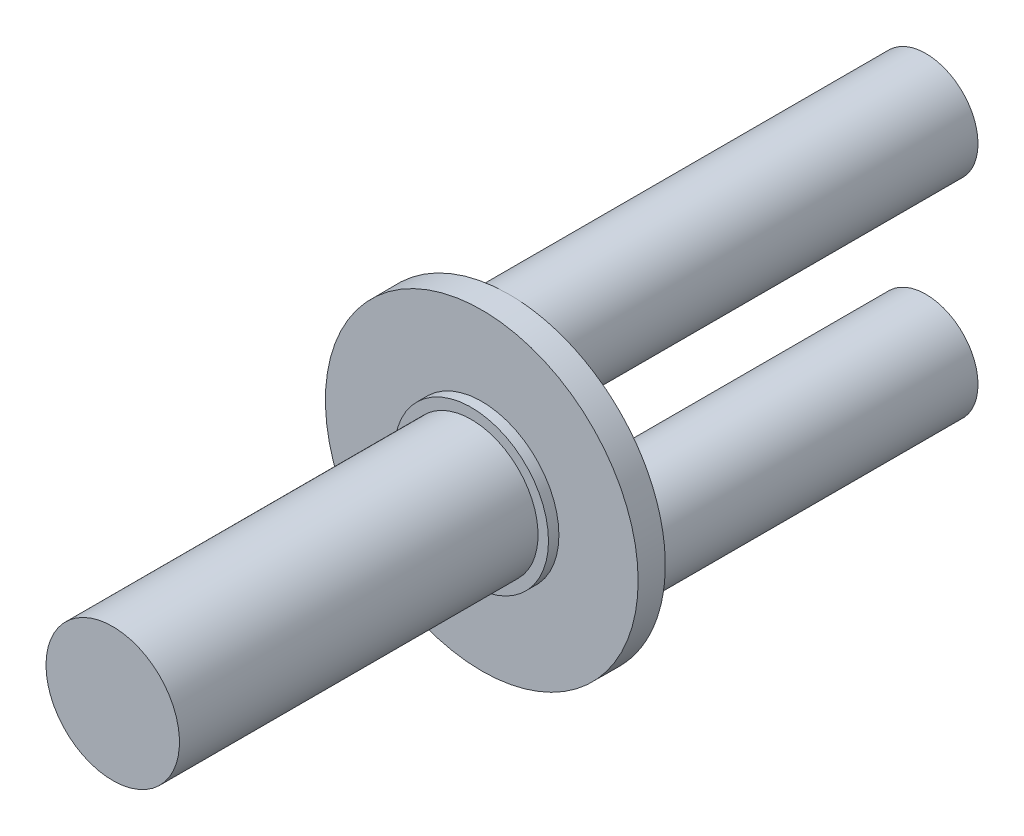
ISO-10303-21;
HEADER;
FILE_DESCRIPTION(('STEP AP214'),'2;1');
FILE_NAME('part.step','',(''),(''),'','','');
FILE_SCHEMA(('AUTOMOTIVE_DESIGN { 1 0 10303 214 1 1 1 1 }'));
ENDSEC;
DATA;
#1=APPLICATION_CONTEXT('core data for automotive mechanical design processes');
#2=APPLICATION_PROTOCOL_DEFINITION('international standard','automotive_design',2000,#1);
#3=PRODUCT_CONTEXT('',#1,'mechanical');
#4=PRODUCT('Part','Part','',(#3));
#5=PRODUCT_RELATED_PRODUCT_CATEGORY('part','',(#4));
#6=PRODUCT_DEFINITION_FORMATION('','',#4);
#7=PRODUCT_DEFINITION_CONTEXT('part definition',#1,'design');
#8=PRODUCT_DEFINITION('design','',#6,#7);
#9=PRODUCT_DEFINITION_SHAPE('','',#8);
#10=(LENGTH_UNIT() NAMED_UNIT(*) SI_UNIT(.MILLI.,.METRE.));
#11=(NAMED_UNIT(*) PLANE_ANGLE_UNIT() SI_UNIT($,.RADIAN.));
#12=(NAMED_UNIT(*) SI_UNIT($,.STERADIAN.) SOLID_ANGLE_UNIT());
#13=UNCERTAINTY_MEASURE_WITH_UNIT(LENGTH_MEASURE(1.E-05),#10,'distance_accuracy_value','');
#14=(GEOMETRIC_REPRESENTATION_CONTEXT(3) GLOBAL_UNCERTAINTY_ASSIGNED_CONTEXT((#13)) GLOBAL_UNIT_ASSIGNED_CONTEXT((#10,
#11,#12)) REPRESENTATION_CONTEXT('',''));
#15=CARTESIAN_POINT('',(0.,0.,0.));
#16=DIRECTION('',(0.,0.,1.));
#17=DIRECTION('',(1.,0.,0.));
#18=AXIS2_PLACEMENT_3D('',#15,#16,#17);
#19=CARTESIAN_POINT('',(0.,12.7,-12.7));
#20=DIRECTION('',(0.,0.,1.));
#21=DIRECTION('',(1.,0.,0.));
#22=AXIS2_PLACEMENT_3D('',#19,#20,#21);
#23=CYLINDRICAL_SURFACE('',#22,1.5875);
#24=CARTESIAN_POINT('',(0.,12.7,-12.7));
#25=DIRECTION('',(0.,0.,1.));
#26=DIRECTION('',(1.,0.,0.));
#27=AXIS2_PLACEMENT_3D('',#24,#25,#26);
#28=CIRCLE('',#27,1.5875);
#29=CARTESIAN_POINT('',(1.5875,12.7,-12.7));
#30=VERTEX_POINT('',#29);
#31=EDGE_CURVE('E11',#30,#30,#28,.T.);
#32=ORIENTED_EDGE('',*,*,#31,.T.);
#33=EDGE_LOOP('',(#32));
#34=FACE_BOUND('',#33,.T.);
#35=CARTESIAN_POINT('',(0.,12.7,0.));
#36=DIRECTION('',(0.,0.,1.));
#37=DIRECTION('',(1.,0.,0.));
#38=AXIS2_PLACEMENT_3D('',#35,#36,#37);
#39=CIRCLE('',#38,1.5875);
#40=CARTESIAN_POINT('',(0.,11.1125,0.));
#41=VERTEX_POINT('',#40);
#42=EDGE_CURVE('E44',#41,#41,#39,.T.);
#43=ORIENTED_EDGE('',*,*,#42,.F.);
#44=EDGE_LOOP('',(#43));
#45=FACE_BOUND('',#44,.T.);
#46=ADVANCED_FACE('F36',(#34,#45),#23,.T.);
#47=CARTESIAN_POINT('',(0.,12.7,-12.7));
#48=DIRECTION('',(0.,0.,1.));
#49=DIRECTION('',(1.,0.,0.));
#50=AXIS2_PLACEMENT_3D('',#47,#48,#49);
#51=PLANE('',#50);
#52=ORIENTED_EDGE('',*,*,#31,.F.);
#53=EDGE_LOOP('',(#52));
#54=FACE_BOUND('',#53,.T.);
#55=ADVANCED_FACE('F88',(#54),#51,.F.);
#56=CARTESIAN_POINT('',(0.,15.875,0.));
#57=DIRECTION('',(0.,0.,1.));
#58=DIRECTION('',(1.,0.,0.));
#59=AXIS2_PLACEMENT_3D('',#56,#57,#58);
#60=PLANE('',#59);
#61=ORIENTED_EDGE('',*,*,#42,.T.);
#62=CARTESIAN_POINT('',(0.,15.875,0.));
#63=DIRECTION('',(0.,0.,1.));
#64=DIRECTION('',(1.,0.,0.));
#65=AXIS2_PLACEMENT_3D('',#62,#63,#64);
#66=CIRCLE('',#65,4.76249999999999);
#67=CARTESIAN_POINT('',(0.,20.6375,0.));
#68=VERTEX_POINT('',#67);
#69=EDGE_CURVE('E59',#68,#41,#66,.T.);
#70=ORIENTED_EDGE('',*,*,#69,.F.);
#71=CARTESIAN_POINT('',(0.,19.05,0.));
#72=DIRECTION('',(0.,0.,1.));
#73=DIRECTION('',(1.,0.,0.));
#74=AXIS2_PLACEMENT_3D('',#71,#72,#73);
#75=CIRCLE('',#74,1.5875);
#76=EDGE_CURVE('E54',#68,#68,#75,.T.);
#77=ORIENTED_EDGE('',*,*,#76,.T.);
#78=EDGE_CURVE('E57',#41,#68,#66,.T.);
#79=ORIENTED_EDGE('',*,*,#78,.F.);
#80=EDGE_LOOP('',(#61,#70,#77,#79));
#81=FACE_BOUND('',#80,.T.);
#82=ADVANCED_FACE('F55',(#81),#60,.F.);
#83=CARTESIAN_POINT('',(0.,19.05,-12.7));
#84=DIRECTION('',(0.,0.,1.));
#85=DIRECTION('',(1.,0.,0.));
#86=AXIS2_PLACEMENT_3D('',#83,#84,#85);
#87=CYLINDRICAL_SURFACE('',#86,1.5875);
#88=CARTESIAN_POINT('',(0.,19.05,-12.7));
#89=DIRECTION('',(0.,0.,1.));
#90=DIRECTION('',(1.,0.,0.));
#91=AXIS2_PLACEMENT_3D('',#88,#89,#90);
#92=CIRCLE('',#91,1.5875);
#93=CARTESIAN_POINT('',(1.5875,19.05,-12.7));
#94=VERTEX_POINT('',#93);
#95=EDGE_CURVE('E61',#94,#94,#92,.T.);
#96=ORIENTED_EDGE('',*,*,#95,.T.);
#97=EDGE_LOOP('',(#96));
#98=FACE_BOUND('',#97,.T.);
#99=ORIENTED_EDGE('',*,*,#76,.F.);
#100=EDGE_LOOP('',(#99));
#101=FACE_BOUND('',#100,.T.);
#102=ADVANCED_FACE('F99',(#98,#101),#87,.T.);
#103=CARTESIAN_POINT('',(0.,19.05,-12.7));
#104=DIRECTION('',(0.,0.,1.));
#105=DIRECTION('',(1.,0.,0.));
#106=AXIS2_PLACEMENT_3D('',#103,#104,#105);
#107=PLANE('',#106);
#108=ORIENTED_EDGE('',*,*,#95,.F.);
#109=EDGE_LOOP('',(#108));
#110=FACE_BOUND('',#109,.T.);
#111=ADVANCED_FACE('F103',(#110),#107,.F.);
#112=CARTESIAN_POINT('',(0.,15.875,0.8255));
#113=DIRECTION('',(0.,0.,-1.));
#114=DIRECTION('',(-1.,0.,0.));
#115=AXIS2_PLACEMENT_3D('',#112,#113,#114);
#116=CYLINDRICAL_SURFACE('',#115,4.76249999999999);
#117=CARTESIAN_POINT('',(0.,15.875,0.8255));
#118=DIRECTION('',(0.,0.,1.));
#119=DIRECTION('',(1.,0.,0.));
#120=AXIS2_PLACEMENT_3D('',#117,#118,#119);
#121=CIRCLE('',#120,4.76249999999999);
#122=CARTESIAN_POINT('',(4.76249999999999,15.875,0.8255));
#123=VERTEX_POINT('',#122);
#124=EDGE_CURVE('E62',#123,#123,#121,.T.);
#125=ORIENTED_EDGE('',*,*,#124,.F.);
#126=EDGE_LOOP('',(#125));
#127=FACE_BOUND('',#126,.T.);
#128=ORIENTED_EDGE('',*,*,#69,.T.);
#129=ORIENTED_EDGE('',*,*,#78,.T.);
#130=EDGE_LOOP('',(#128,#129));
#131=FACE_BOUND('',#130,.T.);
#132=ADVANCED_FACE('F109',(#127,#131),#116,.T.);
#133=CARTESIAN_POINT('',(0.,15.875,0.8255));
#134=DIRECTION('',(0.,0.,1.));
#135=DIRECTION('',(1.,0.,0.));
#136=AXIS2_PLACEMENT_3D('',#133,#134,#135);
#137=PLANE('',#136);
#138=CARTESIAN_POINT('',(0.,15.875,0.8255));
#139=DIRECTION('',(0.,0.,1.));
#140=DIRECTION('',(1.,0.,0.));
#141=AXIS2_PLACEMENT_3D('',#138,#139,#140);
#142=CIRCLE('',#141,2.3495);
#143=CARTESIAN_POINT('',(2.3495,15.875,0.8255));
#144=VERTEX_POINT('',#143);
#145=EDGE_CURVE('E131',#144,#144,#142,.T.);
#146=ORIENTED_EDGE('',*,*,#145,.F.);
#147=EDGE_LOOP('',(#146));
#148=FACE_BOUND('',#147,.T.);
#149=ORIENTED_EDGE('',*,*,#124,.T.);
#150=EDGE_LOOP('',(#149));
#151=FACE_BOUND('',#150,.T.);
#152=ADVANCED_FACE('F113',(#148,#151),#137,.T.);
#153=CARTESIAN_POINT('',(0.,15.875,1.143));
#154=DIRECTION('',(0.,0.,-1.));
#155=DIRECTION('',(-1.,0.,0.));
#156=AXIS2_PLACEMENT_3D('',#153,#154,#155);
#157=CYLINDRICAL_SURFACE('',#156,2.3495);
#158=CARTESIAN_POINT('',(0.,15.875,1.143));
#159=DIRECTION('',(0.,0.,1.));
#160=DIRECTION('',(1.,0.,0.));
#161=AXIS2_PLACEMENT_3D('',#158,#159,#160);
#162=CIRCLE('',#161,2.3495);
#163=CARTESIAN_POINT('',(2.3495,15.875,1.143));
#164=VERTEX_POINT('',#163);
#165=EDGE_CURVE('E130',#164,#164,#162,.T.);
#166=ORIENTED_EDGE('',*,*,#165,.F.);
#167=EDGE_LOOP('',(#166));
#168=FACE_BOUND('',#167,.T.);
#169=ORIENTED_EDGE('',*,*,#145,.T.);
#170=EDGE_LOOP('',(#169));
#171=FACE_BOUND('',#170,.T.);
#172=ADVANCED_FACE('F117',(#168,#171),#157,.T.);
#173=CARTESIAN_POINT('',(0.,15.875,1.143));
#174=DIRECTION('',(0.,0.,1.));
#175=DIRECTION('',(1.,0.,0.));
#176=AXIS2_PLACEMENT_3D('',#173,#174,#175);
#177=PLANE('',#176);
#178=CARTESIAN_POINT('',(0.,15.875,1.143));
#179=DIRECTION('',(0.,0.,1.));
#180=DIRECTION('',(1.,0.,0.));
#181=AXIS2_PLACEMENT_3D('',#178,#179,#180);
#182=CIRCLE('',#181,2.032);
#183=CARTESIAN_POINT('',(-2.032,15.875,1.143));
#184=VERTEX_POINT('',#183);
#185=EDGE_CURVE('E39',#184,#184,#182,.T.);
#186=ORIENTED_EDGE('',*,*,#185,.F.);
#187=EDGE_LOOP('',(#186));
#188=FACE_BOUND('',#187,.T.);
#189=ORIENTED_EDGE('',*,*,#165,.T.);
#190=EDGE_LOOP('',(#189));
#191=FACE_BOUND('',#190,.T.);
#192=ADVANCED_FACE('F83',(#188,#191),#177,.T.);
#193=CARTESIAN_POINT('',(0.,15.875,12.065));
#194=DIRECTION('',(0.,0.,1.));
#195=DIRECTION('',(1.,0.,0.));
#196=AXIS2_PLACEMENT_3D('',#193,#194,#195);
#197=PLANE('',#196);
#198=CARTESIAN_POINT('',(0.,15.875,12.065));
#199=DIRECTION('',(0.,0.,1.));
#200=DIRECTION('',(1.,0.,0.));
#201=AXIS2_PLACEMENT_3D('',#198,#199,#200);
#202=CIRCLE('',#201,2.032);
#203=CARTESIAN_POINT('',(-2.032,15.875,12.065));
#204=VERTEX_POINT('',#203);
#205=EDGE_CURVE('E65',#204,#204,#202,.T.);
#206=ORIENTED_EDGE('',*,*,#205,.T.);
#207=EDGE_LOOP('',(#206));
#208=FACE_BOUND('',#207,.T.);
#209=ADVANCED_FACE('F74',(#208),#197,.T.);
#210=CARTESIAN_POINT('',(0.,15.875,12.065));
#211=DIRECTION('',(0.,0.,-1.));
#212=DIRECTION('',(-1.,0.,0.));
#213=AXIS2_PLACEMENT_3D('',#210,#211,#212);
#214=CYLINDRICAL_SURFACE('',#213,2.032);
#215=CARTESIAN_POINT('',(-2.032,15.875,1.143));
#216=CARTESIAN_POINT('',(-2.032,15.875,1.25677083333333));
#217=CARTESIAN_POINT('',(-2.032,15.875,1.37054166666667));
#218=CARTESIAN_POINT('',(-2.032,15.875,1.59808333333333));
#219=CARTESIAN_POINT('',(-2.032,15.875,1.71185416666667));
#220=CARTESIAN_POINT('',(-2.032,15.875,1.93939583333333));
#221=CARTESIAN_POINT('',(-2.032,15.875,2.05316666666667));
#222=CARTESIAN_POINT('',(-2.032,15.875,2.28070833333333));
#223=CARTESIAN_POINT('',(-2.032,15.875,2.39447916666667));
#224=CARTESIAN_POINT('',(-2.032,15.875,2.62202083333333));
#225=CARTESIAN_POINT('',(-2.032,15.875,2.73579166666667));
#226=CARTESIAN_POINT('',(-2.032,15.875,2.96333333333333));
#227=CARTESIAN_POINT('',(-2.032,15.875,3.07710416666667));
#228=CARTESIAN_POINT('',(-2.032,15.875,3.30464583333333));
#229=CARTESIAN_POINT('',(-2.032,15.875,3.41841666666667));
#230=CARTESIAN_POINT('',(-2.032,15.875,3.64595833333333));
#231=CARTESIAN_POINT('',(-2.032,15.875,3.75972916666667));
#232=CARTESIAN_POINT('',(-2.032,15.875,3.98727083333333));
#233=CARTESIAN_POINT('',(-2.032,15.875,4.10104166666667));
#234=CARTESIAN_POINT('',(-2.032,15.875,4.32858333333333));
#235=CARTESIAN_POINT('',(-2.032,15.875,4.44235416666667));
#236=CARTESIAN_POINT('',(-2.032,15.875,4.66989583333333));
#237=CARTESIAN_POINT('',(-2.032,15.875,4.78366666666667));
#238=CARTESIAN_POINT('',(-2.032,15.875,5.01120833333333));
#239=CARTESIAN_POINT('',(-2.032,15.875,5.12497916666667));
#240=CARTESIAN_POINT('',(-2.032,15.875,5.35252083333333));
#241=CARTESIAN_POINT('',(-2.032,15.875,5.46629166666667));
#242=CARTESIAN_POINT('',(-2.032,15.875,5.69383333333333));
#243=CARTESIAN_POINT('',(-2.032,15.875,5.80760416666667));
#244=CARTESIAN_POINT('',(-2.032,15.875,6.03514583333333));
#245=CARTESIAN_POINT('',(-2.032,15.875,6.14891666666667));
#246=CARTESIAN_POINT('',(-2.032,15.875,6.37645833333333));
#247=CARTESIAN_POINT('',(-2.032,15.875,6.49022916666667));
#248=CARTESIAN_POINT('',(-2.032,15.875,6.71777083333333));
#249=CARTESIAN_POINT('',(-2.032,15.875,6.83154166666667));
#250=CARTESIAN_POINT('',(-2.032,15.875,7.05908333333333));
#251=CARTESIAN_POINT('',(-2.032,15.875,7.17285416666667));
#252=CARTESIAN_POINT('',(-2.032,15.875,7.40039583333333));
#253=CARTESIAN_POINT('',(-2.032,15.875,7.51416666666667));
#254=CARTESIAN_POINT('',(-2.032,15.875,7.74170833333333));
#255=CARTESIAN_POINT('',(-2.032,15.875,7.85547916666667));
#256=CARTESIAN_POINT('',(-2.032,15.875,8.08302083333333));
#257=CARTESIAN_POINT('',(-2.032,15.875,8.19679166666667));
#258=CARTESIAN_POINT('',(-2.032,15.875,8.42433333333333));
#259=CARTESIAN_POINT('',(-2.032,15.875,8.53810416666667));
#260=CARTESIAN_POINT('',(-2.032,15.875,8.76564583333333));
#261=CARTESIAN_POINT('',(-2.032,15.875,8.87941666666667));
#262=CARTESIAN_POINT('',(-2.032,15.875,9.10695833333333));
#263=CARTESIAN_POINT('',(-2.032,15.875,9.22072916666666));
#264=CARTESIAN_POINT('',(-2.032,15.875,9.44827083333333));
#265=CARTESIAN_POINT('',(-2.032,15.875,9.56204166666667));
#266=CARTESIAN_POINT('',(-2.032,15.875,9.78958333333333));
#267=CARTESIAN_POINT('',(-2.032,15.875,9.90335416666666));
#268=CARTESIAN_POINT('',(-2.032,15.875,10.1308958333333));
#269=CARTESIAN_POINT('',(-2.032,15.875,10.2446666666667));
#270=CARTESIAN_POINT('',(-2.032,15.875,10.4722083333333));
#271=CARTESIAN_POINT('',(-2.032,15.875,10.5859791666667));
#272=CARTESIAN_POINT('',(-2.032,15.875,10.8135208333333));
#273=CARTESIAN_POINT('',(-2.032,15.875,10.9272916666667));
#274=CARTESIAN_POINT('',(-2.032,15.875,11.1548333333333));
#275=CARTESIAN_POINT('',(-2.032,15.875,11.2686041666667));
#276=CARTESIAN_POINT('',(-2.032,15.875,11.4961458333333));
#277=CARTESIAN_POINT('',(-2.032,15.875,11.6099166666667));
#278=CARTESIAN_POINT('',(-2.032,15.875,11.8374583333333));
#279=CARTESIAN_POINT('',(-2.032,15.875,11.9512291666667));
#280=CARTESIAN_POINT('',(-2.032,15.875,12.065));
#281=B_SPLINE_CURVE_WITH_KNOTS('',3,(#215,#216,#217,#218,#219,#220,#221,#222,#223,#224,#225,
#226,#227,#228,#229,#230,#231,#232,#233,#234,#235,#236,#237,#238,#239,#240,#241,#242,#243,#244,
#245,#246,#247,#248,#249,#250,#251,#252,#253,#254,#255,#256,#257,#258,#259,#260,#261,#262,#263,
#264,#265,#266,#267,#268,#269,#270,#271,#272,#273,#274,#275,#276,#277,#278,#279,#280),
.UNSPECIFIED.,.F.,.F.,(4,2,2,2,2,2,2,2,2,2,2,2,2,2,2,2,2,2,2,2,2,2,2,2,2,2,2,2,2,2,2,2,4),(0.,
0.3413125,0.682624999999999,1.0239375,1.36525,1.7065625,2.047875,2.3891875,2.7305,3.0718125,
3.413125,3.7544375,4.09575,4.4370625,4.778375,5.1196875,5.461,5.8023125,6.143625,6.4849375,
6.82625,7.1675625,7.508875,7.8501875,8.1915,8.5328125,8.874125,9.2154375,9.55675,9.8980625,
10.239375,10.5806875,10.922),.UNSPECIFIED.);
#282=EDGE_CURVE('BSEAM76',#184,#204,#281,.T.);
#283=ORIENTED_EDGE('',*,*,#185,.T.);
#284=ORIENTED_EDGE('',*,*,#205,.F.);
#285=ORIENTED_EDGE('',*,*,#282,.T.);
#286=ORIENTED_EDGE('',*,*,#282,.F.);
#287=EDGE_LOOP('',(#283,#285,#284,#286));
#288=FACE_BOUND('',#287,.T.);
#289=ADVANCED_FACE('F76',(#288),#214,.T.);
#290=CLOSED_SHELL('',(#46,#55,#82,#102,#111,#132,#152,#172,#192,#209,#289));
#291=MANIFOLD_SOLID_BREP('B2',#290);
#292=ADVANCED_BREP_SHAPE_REPRESENTATION('',(#18,#291),#14);
#293=SHAPE_DEFINITION_REPRESENTATION(#9,#292);
ENDSEC;
END-ISO-10303-21;
